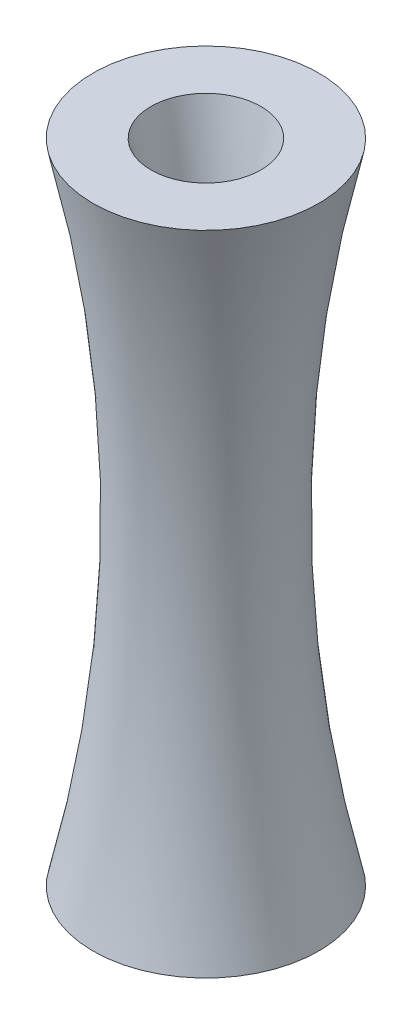
ISO-10303-21;
HEADER;
FILE_DESCRIPTION(('STEP AP214'),'2;1');
FILE_NAME('part.step','',(''),(''),'','','');
FILE_SCHEMA(('AUTOMOTIVE_DESIGN { 1 0 10303 214 1 1 1 1 }'));
ENDSEC;
DATA;
#1=APPLICATION_CONTEXT('core data for automotive mechanical design processes');
#2=APPLICATION_PROTOCOL_DEFINITION('international standard','automotive_design',2000,#1);
#3=PRODUCT_CONTEXT('',#1,'mechanical');
#4=PRODUCT('Part','Part','',(#3));
#5=PRODUCT_RELATED_PRODUCT_CATEGORY('part','',(#4));
#6=PRODUCT_DEFINITION_FORMATION('','',#4);
#7=PRODUCT_DEFINITION_CONTEXT('part definition',#1,'design');
#8=PRODUCT_DEFINITION('design','',#6,#7);
#9=PRODUCT_DEFINITION_SHAPE('','',#8);
#10=(LENGTH_UNIT() NAMED_UNIT(*) SI_UNIT(.MILLI.,.METRE.));
#11=(NAMED_UNIT(*) PLANE_ANGLE_UNIT() SI_UNIT($,.RADIAN.));
#12=(NAMED_UNIT(*) SI_UNIT($,.STERADIAN.) SOLID_ANGLE_UNIT());
#13=UNCERTAINTY_MEASURE_WITH_UNIT(LENGTH_MEASURE(1.E-05),#10,'distance_accuracy_value','');
#14=(GEOMETRIC_REPRESENTATION_CONTEXT(3) GLOBAL_UNCERTAINTY_ASSIGNED_CONTEXT((#13)) GLOBAL_UNIT_ASSIGNED_CONTEXT((#10,
#11,#12)) REPRESENTATION_CONTEXT('',''));
#15=CARTESIAN_POINT('',(0.,0.,0.));
#16=DIRECTION('',(0.,0.,1.));
#17=DIRECTION('',(1.,0.,0.));
#18=AXIS2_PLACEMENT_3D('',#15,#16,#17);
#19=CARTESIAN_POINT('',(8.01456876456877,45.9501942501943,0.));
#20=DIRECTION('',(0.,-1.,0.));
#21=DIRECTION('',(0.,0.,-1.));
#22=AXIS2_PLACEMENT_3D('',#19,#20,#21);
#23=PLANE('',#22);
#24=CARTESIAN_POINT('',(0.,45.9501942501943,0.));
#25=DIRECTION('',(0.,1.,0.));
#26=DIRECTION('',(0.,0.,1.));
#27=AXIS2_PLACEMENT_3D('',#24,#25,#26);
#28=CIRCLE('',#27,8.01456876456877);
#29=CARTESIAN_POINT('',(0.,45.9501942501943,8.01456876456877));
#30=VERTEX_POINT('',#29);
#31=EDGE_CURVE('E34',#30,#30,#28,.T.);
#32=ORIENTED_EDGE('',*,*,#31,.T.);
#33=EDGE_LOOP('',(#32));
#34=FACE_BOUND('',#33,.T.);
#35=CARTESIAN_POINT('',(0.,45.9501942501943,0.));
#36=DIRECTION('',(0.,1.,0.));
#37=DIRECTION('',(0.,0.,1.));
#38=AXIS2_PLACEMENT_3D('',#35,#36,#37);
#39=CIRCLE('',#38,3.90417554902393);
#40=CARTESIAN_POINT('',(0.,45.9501942501943,3.90417554902393));
#41=VERTEX_POINT('',#40);
#42=EDGE_CURVE('E42',#41,#41,#39,.T.);
#43=ORIENTED_EDGE('',*,*,#42,.F.);
#44=EDGE_LOOP('',(#43));
#45=FACE_BOUND('',#44,.T.);
#46=ADVANCED_FACE('F27',(#34,#45),#23,.F.);
#47=CARTESIAN_POINT('',(0.,0.,0.));
#48=DIRECTION('',(0.,1.,0.));
#49=DIRECTION('',(0.,0.,1.));
#50=AXIS2_PLACEMENT_3D('',#47,#48,#49);
#51=PLANE('',#50);
#52=CARTESIAN_POINT('',(0.,0.,0.));
#53=DIRECTION('',(0.,-1.,0.));
#54=DIRECTION('',(0.,0.,-1.));
#55=AXIS2_PLACEMENT_3D('',#52,#53,#54);
#56=CIRCLE('',#55,3.90417554902393);
#57=CARTESIAN_POINT('',(0.,0.,-3.90417554902393));
#58=VERTEX_POINT('',#57);
#59=EDGE_CURVE('E38',#58,#58,#56,.F.);
#60=ORIENTED_EDGE('',*,*,#59,.T.);
#61=EDGE_LOOP('',(#60));
#62=FACE_BOUND('',#61,.T.);
#63=CARTESIAN_POINT('',(0.,0.,0.));
#64=DIRECTION('',(0.,1.,0.));
#65=DIRECTION('',(0.,0.,1.));
#66=AXIS2_PLACEMENT_3D('',#63,#64,#65);
#67=CIRCLE('',#66,8.01456876456877);
#68=CARTESIAN_POINT('',(0.,0.,8.01456876456877));
#69=VERTEX_POINT('',#68);
#70=EDGE_CURVE('E10',#69,#69,#67,.T.);
#71=ORIENTED_EDGE('',*,*,#70,.F.);
#72=EDGE_LOOP('',(#71));
#73=FACE_BOUND('',#72,.T.);
#74=ADVANCED_FACE('F29',(#62,#73),#51,.F.);
#75=CARTESIAN_POINT('',(0.,22.9750971250971,0.));
#76=DIRECTION('',(0.,1.,0.));
#77=DIRECTION('',(0.,0.,1.));
#78=AXIS2_PLACEMENT_3D('',#75,#76,#77);
#79=TOROIDAL_SURFACE('',#78,103.10365810424,97.8253034718303);
#80=ORIENTED_EDGE('',*,*,#31,.F.);
#81=EDGE_LOOP('',(#80));
#82=FACE_BOUND('',#81,.T.);
#83=ORIENTED_EDGE('',*,*,#70,.T.);
#84=EDGE_LOOP('',(#83));
#85=FACE_BOUND('',#84,.T.);
#86=ADVANCED_FACE('F57',(#82,#85),#79,.F.);
#87=CARTESIAN_POINT('',(0.,22.9750971250971,0.));
#88=DIRECTION('',(0.,1.,0.));
#89=DIRECTION('',(0.,0.,1.));
#90=AXIS2_PLACEMENT_3D('',#87,#88,#89);
#91=TOROIDAL_SURFACE('',#90,103.10365810424,101.82530347183);
#92=ORIENTED_EDGE('',*,*,#42,.T.);
#93=EDGE_LOOP('',(#92));
#94=FACE_BOUND('',#93,.T.);
#95=ORIENTED_EDGE('',*,*,#59,.F.);
#96=EDGE_LOOP('',(#95));
#97=FACE_BOUND('',#96,.T.);
#98=ADVANCED_FACE('F48',(#94,#97),#91,.T.);
#99=CLOSED_SHELL('',(#46,#74,#86,#98));
#100=MANIFOLD_SOLID_BREP('B2',#99);
#101=ADVANCED_BREP_SHAPE_REPRESENTATION('',(#18,#100),#14);
#102=SHAPE_DEFINITION_REPRESENTATION(#9,#101);
ENDSEC;
END-ISO-10303-21;
